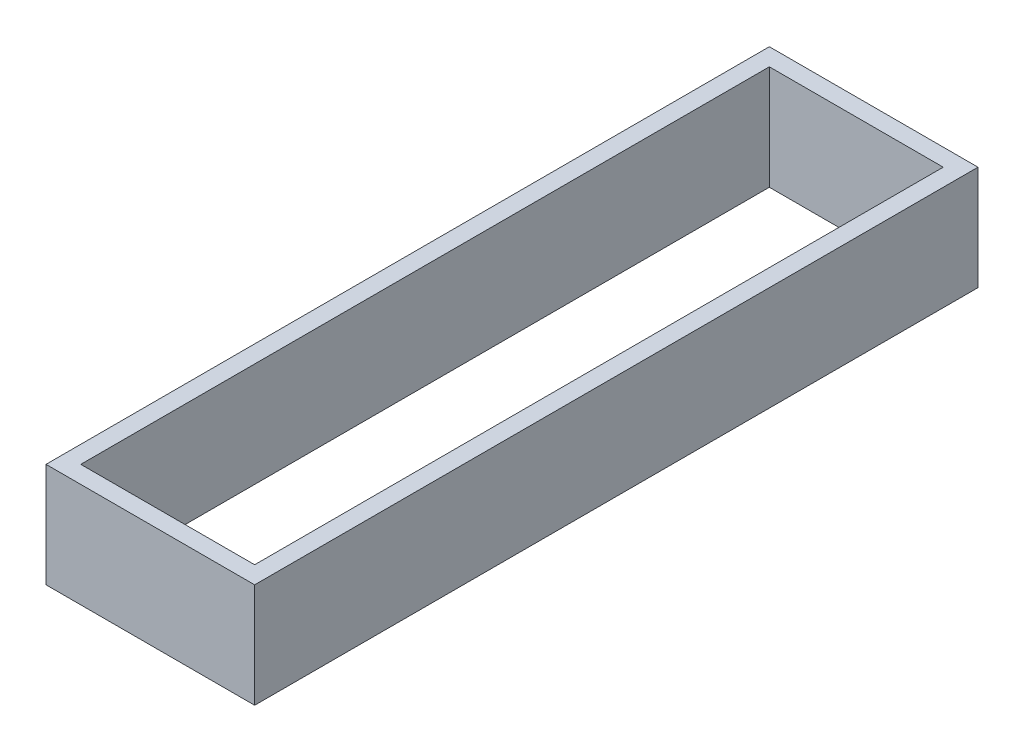
ISO-10303-21;
HEADER;
FILE_DESCRIPTION(('STEP AP214'),'2;1');
FILE_NAME('part.step','',(''),(''),'','','');
FILE_SCHEMA(('AUTOMOTIVE_DESIGN { 1 0 10303 214 1 1 1 1 }'));
ENDSEC;
DATA;
#1=APPLICATION_CONTEXT('core data for automotive mechanical design processes');
#2=APPLICATION_PROTOCOL_DEFINITION('international standard','automotive_design',2000,#1);
#3=PRODUCT_CONTEXT('',#1,'mechanical');
#4=PRODUCT('Part','Part','',(#3));
#5=PRODUCT_RELATED_PRODUCT_CATEGORY('part','',(#4));
#6=PRODUCT_DEFINITION_FORMATION('','',#4);
#7=PRODUCT_DEFINITION_CONTEXT('part definition',#1,'design');
#8=PRODUCT_DEFINITION('design','',#6,#7);
#9=PRODUCT_DEFINITION_SHAPE('','',#8);
#10=(LENGTH_UNIT() NAMED_UNIT(*) SI_UNIT(.MILLI.,.METRE.));
#11=(NAMED_UNIT(*) PLANE_ANGLE_UNIT() SI_UNIT($,.RADIAN.));
#12=(NAMED_UNIT(*) SI_UNIT($,.STERADIAN.) SOLID_ANGLE_UNIT());
#13=UNCERTAINTY_MEASURE_WITH_UNIT(LENGTH_MEASURE(1.E-05),#10,'distance_accuracy_value','');
#14=(GEOMETRIC_REPRESENTATION_CONTEXT(3) GLOBAL_UNCERTAINTY_ASSIGNED_CONTEXT((#13)) GLOBAL_UNIT_ASSIGNED_CONTEXT((#10,
#11,#12)) REPRESENTATION_CONTEXT('',''));
#15=CARTESIAN_POINT('',(0.,0.,0.));
#16=DIRECTION('',(0.,0.,1.));
#17=DIRECTION('',(1.,0.,0.));
#18=AXIS2_PLACEMENT_3D('',#15,#16,#17);
#19=CARTESIAN_POINT('',(0.,30.,0.));
#20=DIRECTION('',(0.,-1.,0.));
#21=DIRECTION('',(0.,0.,-1.));
#22=AXIS2_PLACEMENT_3D('',#19,#20,#21);
#23=PLANE('',#22);
#24=DIRECTION('',(0.,0.,-1.));
#25=VECTOR('',#24,1.);
#26=CARTESIAN_POINT('',(30.,30.,104.));
#27=LINE('',#26,#25);
#28=CARTESIAN_POINT('',(30.,30.,104.));
#29=VERTEX_POINT('',#28);
#30=CARTESIAN_POINT('',(30.,30.,-104.));
#31=VERTEX_POINT('',#30);
#32=EDGE_CURVE('E138',#29,#31,#27,.T.);
#33=ORIENTED_EDGE('',*,*,#32,.T.);
#34=DIRECTION('',(-1.,0.,0.));
#35=VECTOR('',#34,1.);
#36=CARTESIAN_POINT('',(-30.,30.,-104.));
#37=LINE('',#36,#35);
#38=CARTESIAN_POINT('',(-30.,30.,-104.));
#39=VERTEX_POINT('',#38);
#40=EDGE_CURVE('E141',#31,#39,#37,.T.);
#41=ORIENTED_EDGE('',*,*,#40,.T.);
#42=DIRECTION('',(0.,0.,1.));
#43=VECTOR('',#42,1.);
#44=CARTESIAN_POINT('',(-30.,30.,104.));
#45=LINE('',#44,#43);
#46=CARTESIAN_POINT('',(-30.,30.,104.));
#47=VERTEX_POINT('',#46);
#48=EDGE_CURVE('E144',#39,#47,#45,.T.);
#49=ORIENTED_EDGE('',*,*,#48,.T.);
#50=DIRECTION('',(1.,0.,0.));
#51=VECTOR('',#50,1.);
#52=CARTESIAN_POINT('',(-30.,30.,104.));
#53=LINE('',#52,#51);
#54=EDGE_CURVE('E146',#47,#29,#53,.T.);
#55=ORIENTED_EDGE('',*,*,#54,.T.);
#56=EDGE_LOOP('',(#33,#41,#49,#55));
#57=FACE_BOUND('',#56,.T.);
#58=DIRECTION('',(1.,0.,0.));
#59=VECTOR('',#58,1.);
#60=CARTESIAN_POINT('',(-25.,30.,99.));
#61=LINE('',#60,#59);
#62=CARTESIAN_POINT('',(-25.,30.,99.));
#63=VERTEX_POINT('',#62);
#64=CARTESIAN_POINT('',(25.,30.,99.));
#65=VERTEX_POINT('',#64);
#66=EDGE_CURVE('E102',#63,#65,#61,.T.);
#67=ORIENTED_EDGE('',*,*,#66,.F.);
#68=DIRECTION('',(0.,0.,1.));
#69=VECTOR('',#68,1.);
#70=CARTESIAN_POINT('',(-25.,30.,99.));
#71=LINE('',#70,#69);
#72=CARTESIAN_POINT('',(-25.,30.,-99.));
#73=VERTEX_POINT('',#72);
#74=EDGE_CURVE('E124',#73,#63,#71,.T.);
#75=ORIENTED_EDGE('',*,*,#74,.F.);
#76=DIRECTION('',(-1.,0.,0.));
#77=VECTOR('',#76,1.);
#78=CARTESIAN_POINT('',(-25.,30.,-99.));
#79=LINE('',#78,#77);
#80=CARTESIAN_POINT('',(25.,30.,-99.));
#81=VERTEX_POINT('',#80);
#82=EDGE_CURVE('E122',#81,#73,#79,.T.);
#83=ORIENTED_EDGE('',*,*,#82,.F.);
#84=DIRECTION('',(0.,0.,-1.));
#85=VECTOR('',#84,1.);
#86=CARTESIAN_POINT('',(25.,30.,99.));
#87=LINE('',#86,#85);
#88=EDGE_CURVE('E110',#65,#81,#87,.T.);
#89=ORIENTED_EDGE('',*,*,#88,.F.);
#90=EDGE_LOOP('',(#67,#75,#83,#89));
#91=FACE_BOUND('',#90,.T.);
#92=ADVANCED_FACE('F37',(#57,#91),#23,.F.);
#93=CARTESIAN_POINT('',(0.,0.,0.));
#94=DIRECTION('',(0.,-1.,0.));
#95=DIRECTION('',(0.,0.,-1.));
#96=AXIS2_PLACEMENT_3D('',#93,#94,#95);
#97=PLANE('',#96);
#98=DIRECTION('',(0.,0.,-1.));
#99=VECTOR('',#98,1.);
#100=CARTESIAN_POINT('',(30.,0.,104.));
#101=LINE('',#100,#99);
#102=CARTESIAN_POINT('',(30.,0.,104.));
#103=VERTEX_POINT('',#102);
#104=CARTESIAN_POINT('',(30.,0.,-104.));
#105=VERTEX_POINT('',#104);
#106=EDGE_CURVE('E118',#103,#105,#101,.T.);
#107=ORIENTED_EDGE('',*,*,#106,.F.);
#108=DIRECTION('',(1.,0.,0.));
#109=VECTOR('',#108,1.);
#110=CARTESIAN_POINT('',(-30.,0.,104.));
#111=LINE('',#110,#109);
#112=CARTESIAN_POINT('',(-30.,0.,104.));
#113=VERTEX_POINT('',#112);
#114=EDGE_CURVE('E142',#113,#103,#111,.T.);
#115=ORIENTED_EDGE('',*,*,#114,.F.);
#116=DIRECTION('',(0.,0.,1.));
#117=VECTOR('',#116,1.);
#118=CARTESIAN_POINT('',(-30.,0.,104.));
#119=LINE('',#118,#117);
#120=CARTESIAN_POINT('',(-30.,0.,-104.));
#121=VERTEX_POINT('',#120);
#122=EDGE_CURVE('E153',#121,#113,#119,.T.);
#123=ORIENTED_EDGE('',*,*,#122,.F.);
#124=DIRECTION('',(-1.,0.,0.));
#125=VECTOR('',#124,1.);
#126=CARTESIAN_POINT('',(-30.,0.,-104.));
#127=LINE('',#126,#125);
#128=EDGE_CURVE('E151',#105,#121,#127,.T.);
#129=ORIENTED_EDGE('',*,*,#128,.F.);
#130=EDGE_LOOP('',(#107,#115,#123,#129));
#131=FACE_BOUND('',#130,.T.);
#132=DIRECTION('',(0.,0.,1.));
#133=VECTOR('',#132,1.);
#134=CARTESIAN_POINT('',(-25.,0.,99.));
#135=LINE('',#134,#133);
#136=CARTESIAN_POINT('',(-25.,0.,-99.));
#137=VERTEX_POINT('',#136);
#138=CARTESIAN_POINT('',(-25.,0.,99.));
#139=VERTEX_POINT('',#138);
#140=EDGE_CURVE('E111',#137,#139,#135,.T.);
#141=ORIENTED_EDGE('',*,*,#140,.T.);
#142=DIRECTION('',(1.,0.,0.));
#143=VECTOR('',#142,1.);
#144=CARTESIAN_POINT('',(-25.,0.,99.));
#145=LINE('',#144,#143);
#146=CARTESIAN_POINT('',(25.,0.,99.));
#147=VERTEX_POINT('',#146);
#148=EDGE_CURVE('E60',#139,#147,#145,.T.);
#149=ORIENTED_EDGE('',*,*,#148,.T.);
#150=DIRECTION('',(0.,0.,-1.));
#151=VECTOR('',#150,1.);
#152=CARTESIAN_POINT('',(25.,0.,99.));
#153=LINE('',#152,#151);
#154=CARTESIAN_POINT('',(25.,0.,-99.));
#155=VERTEX_POINT('',#154);
#156=EDGE_CURVE('E117',#147,#155,#153,.T.);
#157=ORIENTED_EDGE('',*,*,#156,.T.);
#158=DIRECTION('',(-1.,0.,0.));
#159=VECTOR('',#158,1.);
#160=CARTESIAN_POINT('',(-25.,0.,-99.));
#161=LINE('',#160,#159);
#162=EDGE_CURVE('E130',#155,#137,#161,.T.);
#163=ORIENTED_EDGE('',*,*,#162,.T.);
#164=EDGE_LOOP('',(#141,#149,#157,#163));
#165=FACE_BOUND('',#164,.T.);
#166=ADVANCED_FACE('F171',(#131,#165),#97,.T.);
#167=CARTESIAN_POINT('',(30.,30.,104.));
#168=DIRECTION('',(-1.,0.,0.));
#169=DIRECTION('',(0.,0.,1.));
#170=AXIS2_PLACEMENT_3D('',#167,#168,#169);
#171=PLANE('',#170);
#172=ORIENTED_EDGE('',*,*,#106,.T.);
#173=DIRECTION('',(0.,-1.,0.));
#174=VECTOR('',#173,1.);
#175=CARTESIAN_POINT('',(30.,30.,-104.));
#176=LINE('',#175,#174);
#177=EDGE_CURVE('E11',#31,#105,#176,.T.);
#178=ORIENTED_EDGE('',*,*,#177,.F.);
#179=ORIENTED_EDGE('',*,*,#32,.F.);
#180=DIRECTION('',(0.,-1.,0.));
#181=VECTOR('',#180,1.);
#182=CARTESIAN_POINT('',(30.,30.,104.));
#183=LINE('',#182,#181);
#184=EDGE_CURVE('E148',#29,#103,#183,.T.);
#185=ORIENTED_EDGE('',*,*,#184,.T.);
#186=EDGE_LOOP('',(#172,#178,#179,#185));
#187=FACE_BOUND('',#186,.T.);
#188=ADVANCED_FACE('F39',(#187),#171,.F.);
#189=CARTESIAN_POINT('',(-30.,30.,-104.));
#190=DIRECTION('',(0.,0.,1.));
#191=DIRECTION('',(1.,0.,0.));
#192=AXIS2_PLACEMENT_3D('',#189,#190,#191);
#193=PLANE('',#192);
#194=ORIENTED_EDGE('',*,*,#128,.T.);
#195=DIRECTION('',(0.,-1.,0.));
#196=VECTOR('',#195,1.);
#197=CARTESIAN_POINT('',(-30.,30.,-104.));
#198=LINE('',#197,#196);
#199=EDGE_CURVE('E45',#39,#121,#198,.T.);
#200=ORIENTED_EDGE('',*,*,#199,.F.);
#201=ORIENTED_EDGE('',*,*,#40,.F.);
#202=ORIENTED_EDGE('',*,*,#177,.T.);
#203=EDGE_LOOP('',(#194,#200,#201,#202));
#204=FACE_BOUND('',#203,.T.);
#205=ADVANCED_FACE('F181',(#204),#193,.F.);
#206=CARTESIAN_POINT('',(-30.,30.,104.));
#207=DIRECTION('',(1.,0.,0.));
#208=DIRECTION('',(0.,0.,-1.));
#209=AXIS2_PLACEMENT_3D('',#206,#207,#208);
#210=PLANE('',#209);
#211=ORIENTED_EDGE('',*,*,#122,.T.);
#212=DIRECTION('',(0.,-1.,0.));
#213=VECTOR('',#212,1.);
#214=CARTESIAN_POINT('',(-30.,30.,104.));
#215=LINE('',#214,#213);
#216=EDGE_CURVE('E158',#47,#113,#215,.T.);
#217=ORIENTED_EDGE('',*,*,#216,.F.);
#218=ORIENTED_EDGE('',*,*,#48,.F.);
#219=ORIENTED_EDGE('',*,*,#199,.T.);
#220=EDGE_LOOP('',(#211,#217,#218,#219));
#221=FACE_BOUND('',#220,.T.);
#222=ADVANCED_FACE('F165',(#221),#210,.F.);
#223=CARTESIAN_POINT('',(-30.,30.,104.));
#224=DIRECTION('',(0.,0.,-1.));
#225=DIRECTION('',(-1.,0.,0.));
#226=AXIS2_PLACEMENT_3D('',#223,#224,#225);
#227=PLANE('',#226);
#228=ORIENTED_EDGE('',*,*,#114,.T.);
#229=ORIENTED_EDGE('',*,*,#184,.F.);
#230=ORIENTED_EDGE('',*,*,#54,.F.);
#231=ORIENTED_EDGE('',*,*,#216,.T.);
#232=EDGE_LOOP('',(#228,#229,#230,#231));
#233=FACE_BOUND('',#232,.T.);
#234=ADVANCED_FACE('F175',(#233),#227,.F.);
#235=CARTESIAN_POINT('',(-25.,30.,99.));
#236=DIRECTION('',(0.,0.,-1.));
#237=DIRECTION('',(-1.,0.,0.));
#238=AXIS2_PLACEMENT_3D('',#235,#236,#237);
#239=PLANE('',#238);
#240=ORIENTED_EDGE('',*,*,#148,.F.);
#241=DIRECTION('',(0.,-1.,0.));
#242=VECTOR('',#241,1.);
#243=CARTESIAN_POINT('',(-25.,30.,99.));
#244=LINE('',#243,#242);
#245=EDGE_CURVE('E106',#63,#139,#244,.T.);
#246=ORIENTED_EDGE('',*,*,#245,.F.);
#247=ORIENTED_EDGE('',*,*,#66,.T.);
#248=DIRECTION('',(0.,-1.,0.));
#249=VECTOR('',#248,1.);
#250=CARTESIAN_POINT('',(25.,30.,99.));
#251=LINE('',#250,#249);
#252=EDGE_CURVE('E105',#65,#147,#251,.T.);
#253=ORIENTED_EDGE('',*,*,#252,.T.);
#254=EDGE_LOOP('',(#240,#246,#247,#253));
#255=FACE_BOUND('',#254,.T.);
#256=ADVANCED_FACE('F104',(#255),#239,.T.);
#257=CARTESIAN_POINT('',(25.,30.,99.));
#258=DIRECTION('',(-1.,0.,0.));
#259=DIRECTION('',(0.,0.,1.));
#260=AXIS2_PLACEMENT_3D('',#257,#258,#259);
#261=PLANE('',#260);
#262=ORIENTED_EDGE('',*,*,#156,.F.);
#263=ORIENTED_EDGE('',*,*,#252,.F.);
#264=ORIENTED_EDGE('',*,*,#88,.T.);
#265=DIRECTION('',(0.,-1.,0.));
#266=VECTOR('',#265,1.);
#267=CARTESIAN_POINT('',(25.,30.,-99.));
#268=LINE('',#267,#266);
#269=EDGE_CURVE('E119',#81,#155,#268,.T.);
#270=ORIENTED_EDGE('',*,*,#269,.T.);
#271=EDGE_LOOP('',(#262,#263,#264,#270));
#272=FACE_BOUND('',#271,.T.);
#273=ADVANCED_FACE('F114',(#272),#261,.T.);
#274=CARTESIAN_POINT('',(-25.,30.,-99.));
#275=DIRECTION('',(0.,0.,1.));
#276=DIRECTION('',(1.,0.,0.));
#277=AXIS2_PLACEMENT_3D('',#274,#275,#276);
#278=PLANE('',#277);
#279=ORIENTED_EDGE('',*,*,#162,.F.);
#280=ORIENTED_EDGE('',*,*,#269,.F.);
#281=ORIENTED_EDGE('',*,*,#82,.T.);
#282=DIRECTION('',(0.,-1.,0.));
#283=VECTOR('',#282,1.);
#284=CARTESIAN_POINT('',(-25.,30.,-99.));
#285=LINE('',#284,#283);
#286=EDGE_CURVE('E52',#73,#137,#285,.T.);
#287=ORIENTED_EDGE('',*,*,#286,.T.);
#288=EDGE_LOOP('',(#279,#280,#281,#287));
#289=FACE_BOUND('',#288,.T.);
#290=ADVANCED_FACE('F204',(#289),#278,.T.);
#291=CARTESIAN_POINT('',(-25.,30.,99.));
#292=DIRECTION('',(1.,0.,0.));
#293=DIRECTION('',(0.,0.,-1.));
#294=AXIS2_PLACEMENT_3D('',#291,#292,#293);
#295=PLANE('',#294);
#296=ORIENTED_EDGE('',*,*,#140,.F.);
#297=ORIENTED_EDGE('',*,*,#286,.F.);
#298=ORIENTED_EDGE('',*,*,#74,.T.);
#299=ORIENTED_EDGE('',*,*,#245,.T.);
#300=EDGE_LOOP('',(#296,#297,#298,#299));
#301=FACE_BOUND('',#300,.T.);
#302=ADVANCED_FACE('F208',(#301),#295,.T.);
#303=CLOSED_SHELL('',(#92,#166,#188,#205,#222,#234,#256,#273,#290,#302));
#304=MANIFOLD_SOLID_BREP('B2',#303);
#305=ADVANCED_BREP_SHAPE_REPRESENTATION('',(#18,#304),#14);
#306=SHAPE_DEFINITION_REPRESENTATION(#9,#305);
ENDSEC;
END-ISO-10303-21;
